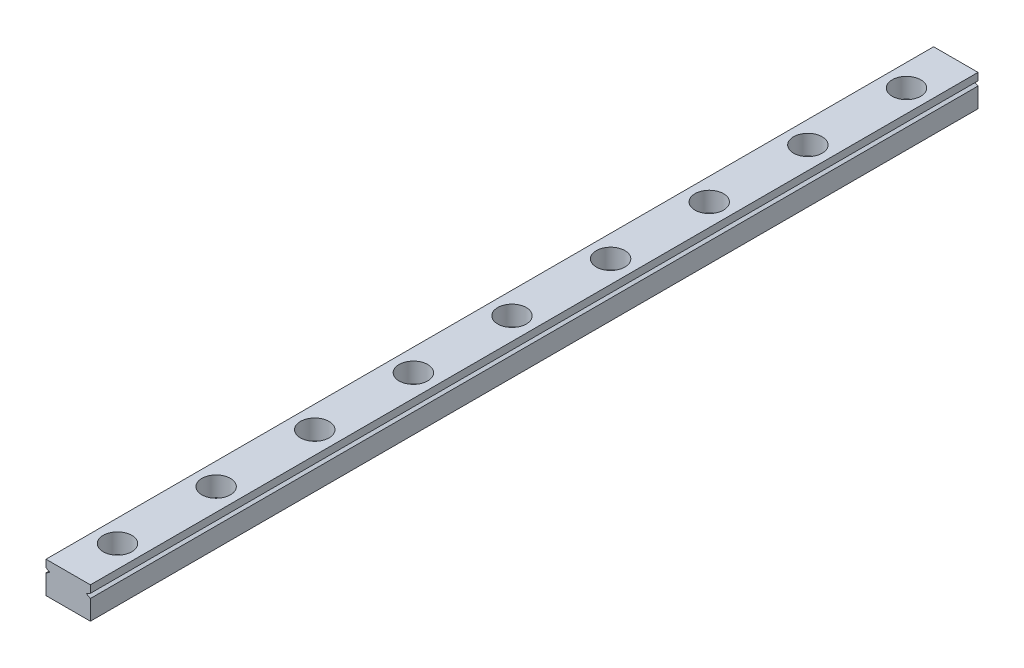
ISO-10303-21;
HEADER;
FILE_DESCRIPTION(('STEP AP214'),'2;1');
FILE_NAME('part.step','',(''),(''),'','','');
FILE_SCHEMA(('AUTOMOTIVE_DESIGN { 1 0 10303 214 1 1 1 1 }'));
ENDSEC;
DATA;
#1=APPLICATION_CONTEXT('core data for automotive mechanical design processes');
#2=APPLICATION_PROTOCOL_DEFINITION('international standard','automotive_design',2000,#1);
#3=PRODUCT_CONTEXT('',#1,'mechanical');
#4=PRODUCT('Part','Part','',(#3));
#5=PRODUCT_RELATED_PRODUCT_CATEGORY('part','',(#4));
#6=PRODUCT_DEFINITION_FORMATION('','',#4);
#7=PRODUCT_DEFINITION_CONTEXT('part definition',#1,'design');
#8=PRODUCT_DEFINITION('design','',#6,#7);
#9=PRODUCT_DEFINITION_SHAPE('','',#8);
#10=(LENGTH_UNIT() NAMED_UNIT(*) SI_UNIT(.MILLI.,.METRE.));
#11=(NAMED_UNIT(*) PLANE_ANGLE_UNIT() SI_UNIT($,.RADIAN.));
#12=(NAMED_UNIT(*) SI_UNIT($,.STERADIAN.) SOLID_ANGLE_UNIT());
#13=UNCERTAINTY_MEASURE_WITH_UNIT(LENGTH_MEASURE(1.E-05),#10,'distance_accuracy_value','');
#14=(GEOMETRIC_REPRESENTATION_CONTEXT(3) GLOBAL_UNCERTAINTY_ASSIGNED_CONTEXT((#13)) GLOBAL_UNIT_ASSIGNED_CONTEXT((#10,
#11,#12)) REPRESENTATION_CONTEXT('',''));
#15=CARTESIAN_POINT('',(0.,0.,0.));
#16=DIRECTION('',(0.,0.,1.));
#17=DIRECTION('',(1.,0.,0.));
#18=AXIS2_PLACEMENT_3D('',#15,#16,#17);
#19=CARTESIAN_POINT('',(0.,4.,180.));
#20=DIRECTION('',(1.,0.,0.));
#21=DIRECTION('',(0.,0.,-1.));
#22=AXIS2_PLACEMENT_3D('',#19,#20,#21);
#23=PLANE('',#22);
#24=DIRECTION('',(0.,-1.,0.));
#25=VECTOR('',#24,1.);
#26=CARTESIAN_POINT('',(0.,4.,0.));
#27=LINE('',#26,#25);
#28=CARTESIAN_POINT('',(0.,4.,0.));
#29=VERTEX_POINT('',#28);
#30=CARTESIAN_POINT('',(0.,0.,0.));
#31=VERTEX_POINT('',#30);
#32=EDGE_CURVE('E141',#29,#31,#27,.T.);
#33=ORIENTED_EDGE('',*,*,#32,.T.);
#34=DIRECTION('',(0.,0.,-1.));
#35=VECTOR('',#34,1.);
#36=CARTESIAN_POINT('',(0.,0.,180.));
#37=LINE('',#36,#35);
#38=CARTESIAN_POINT('',(0.,0.,180.));
#39=VERTEX_POINT('',#38);
#40=EDGE_CURVE('E11',#39,#31,#37,.T.);
#41=ORIENTED_EDGE('',*,*,#40,.F.);
#42=DIRECTION('',(0.,-1.,0.));
#43=VECTOR('',#42,1.);
#44=CARTESIAN_POINT('',(0.,4.,180.));
#45=LINE('',#44,#43);
#46=CARTESIAN_POINT('',(0.,4.,180.));
#47=VERTEX_POINT('',#46);
#48=EDGE_CURVE('E160',#47,#39,#45,.T.);
#49=ORIENTED_EDGE('',*,*,#48,.F.);
#50=DIRECTION('',(0.,0.,-1.));
#51=VECTOR('',#50,1.);
#52=CARTESIAN_POINT('',(0.,4.,180.));
#53=LINE('',#52,#51);
#54=EDGE_CURVE('E137',#47,#29,#53,.T.);
#55=ORIENTED_EDGE('',*,*,#54,.T.);
#56=EDGE_LOOP('',(#33,#41,#49,#55));
#57=FACE_BOUND('',#56,.T.);
#58=ADVANCED_FACE('F33',(#57),#23,.F.);
#59=CARTESIAN_POINT('',(0.,0.,180.));
#60=DIRECTION('',(0.,1.,0.));
#61=DIRECTION('',(0.,0.,1.));
#62=AXIS2_PLACEMENT_3D('',#59,#60,#61);
#63=PLANE('',#62);
#64=CARTESIAN_POINT('',(4.5,0.,170.));
#65=DIRECTION('',(0.,1.,0.));
#66=DIRECTION('',(0.,0.,1.));
#67=AXIS2_PLACEMENT_3D('',#64,#65,#66);
#68=CIRCLE('',#67,1.70000000000001);
#69=CARTESIAN_POINT('',(4.5,0.,171.7));
#70=VERTEX_POINT('',#69);
#71=EDGE_CURVE('E211',#70,#70,#68,.T.);
#72=ORIENTED_EDGE('',*,*,#71,.T.);
#73=EDGE_LOOP('',(#72));
#74=FACE_BOUND('',#73,.T.);
#75=CARTESIAN_POINT('',(4.49999999999993,0.,150.));
#76=DIRECTION('',(0.,1.,0.));
#77=DIRECTION('',(0.,0.,1.));
#78=AXIS2_PLACEMENT_3D('',#75,#76,#77);
#79=CIRCLE('',#78,1.70000000000001);
#80=CARTESIAN_POINT('',(4.49999999999993,0.,151.7));
#81=VERTEX_POINT('',#80);
#82=EDGE_CURVE('E306',#81,#81,#79,.T.);
#83=ORIENTED_EDGE('',*,*,#82,.T.);
#84=EDGE_LOOP('',(#83));
#85=FACE_BOUND('',#84,.T.);
#86=CARTESIAN_POINT('',(4.49999999999986,0.,130.));
#87=DIRECTION('',(0.,1.,0.));
#88=DIRECTION('',(0.,0.,1.));
#89=AXIS2_PLACEMENT_3D('',#86,#87,#88);
#90=CIRCLE('',#89,1.70000000000001);
#91=CARTESIAN_POINT('',(4.49999999999986,0.,131.7));
#92=VERTEX_POINT('',#91);
#93=EDGE_CURVE('E300',#92,#92,#90,.T.);
#94=ORIENTED_EDGE('',*,*,#93,.T.);
#95=EDGE_LOOP('',(#94));
#96=FACE_BOUND('',#95,.T.);
#97=CARTESIAN_POINT('',(4.49999999999979,0.,110.));
#98=DIRECTION('',(0.,1.,0.));
#99=DIRECTION('',(0.,0.,1.));
#100=AXIS2_PLACEMENT_3D('',#97,#98,#99);
#101=CIRCLE('',#100,1.70000000000001);
#102=CARTESIAN_POINT('',(4.49999999999979,0.,111.7));
#103=VERTEX_POINT('',#102);
#104=EDGE_CURVE('E294',#103,#103,#101,.T.);
#105=ORIENTED_EDGE('',*,*,#104,.T.);
#106=EDGE_LOOP('',(#105));
#107=FACE_BOUND('',#106,.T.);
#108=CARTESIAN_POINT('',(4.49999999999972,0.,90.));
#109=DIRECTION('',(0.,1.,0.));
#110=DIRECTION('',(0.,0.,1.));
#111=AXIS2_PLACEMENT_3D('',#108,#109,#110);
#112=CIRCLE('',#111,1.70000000000001);
#113=CARTESIAN_POINT('',(4.49999999999972,0.,91.7));
#114=VERTEX_POINT('',#113);
#115=EDGE_CURVE('E288',#114,#114,#112,.T.);
#116=ORIENTED_EDGE('',*,*,#115,.T.);
#117=EDGE_LOOP('',(#116));
#118=FACE_BOUND('',#117,.T.);
#119=CARTESIAN_POINT('',(4.49999999999965,0.,70.));
#120=DIRECTION('',(0.,1.,0.));
#121=DIRECTION('',(0.,0.,1.));
#122=AXIS2_PLACEMENT_3D('',#119,#120,#121);
#123=CIRCLE('',#122,1.70000000000001);
#124=CARTESIAN_POINT('',(4.49999999999965,0.,71.7));
#125=VERTEX_POINT('',#124);
#126=EDGE_CURVE('E282',#125,#125,#123,.T.);
#127=ORIENTED_EDGE('',*,*,#126,.T.);
#128=EDGE_LOOP('',(#127));
#129=FACE_BOUND('',#128,.T.);
#130=CARTESIAN_POINT('',(4.49999999999958,0.,50.));
#131=DIRECTION('',(0.,1.,0.));
#132=DIRECTION('',(0.,0.,1.));
#133=AXIS2_PLACEMENT_3D('',#130,#131,#132);
#134=CIRCLE('',#133,1.7);
#135=CARTESIAN_POINT('',(4.49999999999958,0.,51.7));
#136=VERTEX_POINT('',#135);
#137=EDGE_CURVE('E276',#136,#136,#134,.T.);
#138=ORIENTED_EDGE('',*,*,#137,.T.);
#139=EDGE_LOOP('',(#138));
#140=FACE_BOUND('',#139,.T.);
#141=CARTESIAN_POINT('',(4.49999999999951,0.,30.0000000000001));
#142=DIRECTION('',(0.,1.,0.));
#143=DIRECTION('',(0.,0.,1.));
#144=AXIS2_PLACEMENT_3D('',#141,#142,#143);
#145=CIRCLE('',#144,1.70000000000001);
#146=CARTESIAN_POINT('',(4.49999999999951,0.,31.7000000000001));
#147=VERTEX_POINT('',#146);
#148=EDGE_CURVE('E270',#147,#147,#145,.T.);
#149=ORIENTED_EDGE('',*,*,#148,.T.);
#150=EDGE_LOOP('',(#149));
#151=FACE_BOUND('',#150,.T.);
#152=CARTESIAN_POINT('',(4.49999999999944,0.,10.0000000000001));
#153=DIRECTION('',(0.,1.,0.));
#154=DIRECTION('',(0.,0.,1.));
#155=AXIS2_PLACEMENT_3D('',#152,#153,#154);
#156=CIRCLE('',#155,1.70000000000001);
#157=CARTESIAN_POINT('',(4.49999999999944,0.,11.7000000000001));
#158=VERTEX_POINT('',#157);
#159=EDGE_CURVE('E264',#158,#158,#156,.T.);
#160=ORIENTED_EDGE('',*,*,#159,.T.);
#161=EDGE_LOOP('',(#160));
#162=FACE_BOUND('',#161,.T.);
#163=DIRECTION('',(1.,0.,0.));
#164=VECTOR('',#163,1.);
#165=CARTESIAN_POINT('',(0.,0.,0.));
#166=LINE('',#165,#164);
#167=CARTESIAN_POINT('',(9.,0.,0.));
#168=VERTEX_POINT('',#167);
#169=EDGE_CURVE('E144',#31,#168,#166,.T.);
#170=ORIENTED_EDGE('',*,*,#169,.T.);
#171=DIRECTION('',(0.,0.,-1.));
#172=VECTOR('',#171,1.);
#173=CARTESIAN_POINT('',(9.,0.,180.));
#174=LINE('',#173,#172);
#175=CARTESIAN_POINT('',(9.,0.,180.));
#176=VERTEX_POINT('',#175);
#177=EDGE_CURVE('E41',#176,#168,#174,.T.);
#178=ORIENTED_EDGE('',*,*,#177,.F.);
#179=DIRECTION('',(1.,0.,0.));
#180=VECTOR('',#179,1.);
#181=CARTESIAN_POINT('',(0.,0.,180.));
#182=LINE('',#181,#180);
#183=EDGE_CURVE('E98',#39,#176,#182,.T.);
#184=ORIENTED_EDGE('',*,*,#183,.F.);
#185=ORIENTED_EDGE('',*,*,#40,.T.);
#186=EDGE_LOOP('',(#170,#178,#184,#185));
#187=FACE_BOUND('',#186,.T.);
#188=ADVANCED_FACE('F315',(#74,#85,#96,#107,#118,#129,#140,#151,#162,#187),#63,.F.);
#189=CARTESIAN_POINT('',(9.,4.,180.));
#190=DIRECTION('',(-1.,0.,0.));
#191=DIRECTION('',(0.,-1.,0.));
#192=AXIS2_PLACEMENT_3D('',#189,#190,#191);
#193=PLANE('',#192);
#194=DIRECTION('',(0.,1.,0.));
#195=VECTOR('',#194,1.);
#196=CARTESIAN_POINT('',(9.,4.,0.));
#197=LINE('',#196,#195);
#198=CARTESIAN_POINT('',(9.,4.,0.));
#199=VERTEX_POINT('',#198);
#200=EDGE_CURVE('E147',#168,#199,#197,.T.);
#201=ORIENTED_EDGE('',*,*,#200,.T.);
#202=DIRECTION('',(0.,0.,-1.));
#203=VECTOR('',#202,1.);
#204=CARTESIAN_POINT('',(9.,4.,180.));
#205=LINE('',#204,#203);
#206=CARTESIAN_POINT('',(9.,4.,180.));
#207=VERTEX_POINT('',#206);
#208=EDGE_CURVE('E173',#207,#199,#205,.T.);
#209=ORIENTED_EDGE('',*,*,#208,.F.);
#210=DIRECTION('',(0.,1.,0.));
#211=VECTOR('',#210,1.);
#212=CARTESIAN_POINT('',(9.,4.,180.));
#213=LINE('',#212,#211);
#214=EDGE_CURVE('E181',#176,#207,#213,.T.);
#215=ORIENTED_EDGE('',*,*,#214,.F.);
#216=ORIENTED_EDGE('',*,*,#177,.T.);
#217=EDGE_LOOP('',(#201,#209,#215,#216));
#218=FACE_BOUND('',#217,.T.);
#219=ADVANCED_FACE('F179',(#218),#193,.F.);
#220=CARTESIAN_POINT('',(8.2,4.45,180.));
#221=DIRECTION('',(-0.490261239632559,-0.871575537124549,0.));
#222=DIRECTION('',(0.87157553712455,-0.490261239632559,0.));
#223=AXIS2_PLACEMENT_3D('',#220,#221,#222);
#224=PLANE('',#223);
#225=DIRECTION('',(-0.871575537124549,0.490261239632559,0.));
#226=VECTOR('',#225,1.);
#227=CARTESIAN_POINT('',(8.2,4.45,0.));
#228=LINE('',#227,#226);
#229=CARTESIAN_POINT('',(8.2,4.45,0.));
#230=VERTEX_POINT('',#229);
#231=EDGE_CURVE('E149',#199,#230,#228,.T.);
#232=ORIENTED_EDGE('',*,*,#231,.T.);
#233=DIRECTION('',(0.,0.,-1.));
#234=VECTOR('',#233,1.);
#235=CARTESIAN_POINT('',(8.2,4.45,180.));
#236=LINE('',#235,#234);
#237=CARTESIAN_POINT('',(8.2,4.45,180.));
#238=VERTEX_POINT('',#237);
#239=EDGE_CURVE('E170',#238,#230,#236,.T.);
#240=ORIENTED_EDGE('',*,*,#239,.F.);
#241=DIRECTION('',(-0.871575537124549,0.490261239632559,0.));
#242=VECTOR('',#241,1.);
#243=CARTESIAN_POINT('',(8.2,4.45,180.));
#244=LINE('',#243,#242);
#245=EDGE_CURVE('E199',#207,#238,#244,.T.);
#246=ORIENTED_EDGE('',*,*,#245,.F.);
#247=ORIENTED_EDGE('',*,*,#208,.T.);
#248=EDGE_LOOP('',(#232,#240,#246,#247));
#249=FACE_BOUND('',#248,.T.);
#250=ADVANCED_FACE('F190',(#249),#224,.F.);
#251=CARTESIAN_POINT('',(9.,4.9,180.));
#252=DIRECTION('',(-0.490261239632559,0.871575537124549,0.));
#253=DIRECTION('',(-0.87157553712455,-0.490261239632559,0.));
#254=AXIS2_PLACEMENT_3D('',#251,#252,#253);
#255=PLANE('',#254);
#256=DIRECTION('',(0.871575537124549,0.490261239632559,0.));
#257=VECTOR('',#256,1.);
#258=CARTESIAN_POINT('',(9.,4.9,0.));
#259=LINE('',#258,#257);
#260=CARTESIAN_POINT('',(9.,4.9,0.));
#261=VERTEX_POINT('',#260);
#262=EDGE_CURVE('E151',#230,#261,#259,.T.);
#263=ORIENTED_EDGE('',*,*,#262,.T.);
#264=DIRECTION('',(0.,0.,-1.));
#265=VECTOR('',#264,1.);
#266=CARTESIAN_POINT('',(9.,4.9,180.));
#267=LINE('',#266,#265);
#268=CARTESIAN_POINT('',(9.,4.9,180.));
#269=VERTEX_POINT('',#268);
#270=EDGE_CURVE('E167',#269,#261,#267,.T.);
#271=ORIENTED_EDGE('',*,*,#270,.F.);
#272=DIRECTION('',(0.871575537124549,0.490261239632559,0.));
#273=VECTOR('',#272,1.);
#274=CARTESIAN_POINT('',(9.,4.9,180.));
#275=LINE('',#274,#273);
#276=EDGE_CURVE('E196',#238,#269,#275,.T.);
#277=ORIENTED_EDGE('',*,*,#276,.F.);
#278=ORIENTED_EDGE('',*,*,#239,.T.);
#279=EDGE_LOOP('',(#263,#271,#277,#278));
#280=FACE_BOUND('',#279,.T.);
#281=ADVANCED_FACE('F194',(#280),#255,.F.);
#282=CARTESIAN_POINT('',(9.,6.4,180.));
#283=DIRECTION('',(-1.,0.,0.));
#284=DIRECTION('',(0.,0.,1.));
#285=AXIS2_PLACEMENT_3D('',#282,#283,#284);
#286=PLANE('',#285);
#287=DIRECTION('',(0.,1.,0.));
#288=VECTOR('',#287,1.);
#289=CARTESIAN_POINT('',(9.,6.4,0.));
#290=LINE('',#289,#288);
#291=CARTESIAN_POINT('',(9.,6.4,0.));
#292=VERTEX_POINT('',#291);
#293=EDGE_CURVE('E153',#261,#292,#290,.T.);
#294=ORIENTED_EDGE('',*,*,#293,.T.);
#295=DIRECTION('',(0.,0.,-1.));
#296=VECTOR('',#295,1.);
#297=CARTESIAN_POINT('',(9.,6.4,180.));
#298=LINE('',#297,#296);
#299=CARTESIAN_POINT('',(9.,6.4,180.));
#300=VERTEX_POINT('',#299);
#301=EDGE_CURVE('E164',#300,#292,#298,.T.);
#302=ORIENTED_EDGE('',*,*,#301,.F.);
#303=DIRECTION('',(0.,1.,0.));
#304=VECTOR('',#303,1.);
#305=CARTESIAN_POINT('',(9.,6.4,180.));
#306=LINE('',#305,#304);
#307=EDGE_CURVE('E198',#269,#300,#306,.T.);
#308=ORIENTED_EDGE('',*,*,#307,.F.);
#309=ORIENTED_EDGE('',*,*,#270,.T.);
#310=EDGE_LOOP('',(#294,#302,#308,#309));
#311=FACE_BOUND('',#310,.T.);
#312=ADVANCED_FACE('F342',(#311),#286,.F.);
#313=CARTESIAN_POINT('',(0.,6.4,180.));
#314=DIRECTION('',(0.,-1.,0.));
#315=DIRECTION('',(0.,0.,-1.));
#316=AXIS2_PLACEMENT_3D('',#313,#314,#315);
#317=PLANE('',#316);
#318=CARTESIAN_POINT('',(4.5,6.4,170.));
#319=DIRECTION('',(0.,1.,0.));
#320=DIRECTION('',(0.,0.,1.));
#321=AXIS2_PLACEMENT_3D('',#318,#319,#320);
#322=CIRCLE('',#321,2.90000000000002);
#323=CARTESIAN_POINT('',(4.5,6.4,172.9));
#324=VERTEX_POINT('',#323);
#325=EDGE_CURVE('E256',#324,#324,#322,.T.);
#326=ORIENTED_EDGE('',*,*,#325,.F.);
#327=EDGE_LOOP('',(#326));
#328=FACE_BOUND('',#327,.T.);
#329=CARTESIAN_POINT('',(4.49999999999993,6.4,150.));
#330=DIRECTION('',(0.,1.,0.));
#331=DIRECTION('',(0.,0.,1.));
#332=AXIS2_PLACEMENT_3D('',#329,#330,#331);
#333=CIRCLE('',#332,2.90000000000002);
#334=CARTESIAN_POINT('',(4.49999999999993,6.4,152.9));
#335=VERTEX_POINT('',#334);
#336=EDGE_CURVE('E250',#335,#335,#333,.T.);
#337=ORIENTED_EDGE('',*,*,#336,.F.);
#338=EDGE_LOOP('',(#337));
#339=FACE_BOUND('',#338,.T.);
#340=CARTESIAN_POINT('',(4.49999999999986,6.4,130.));
#341=DIRECTION('',(0.,1.,0.));
#342=DIRECTION('',(0.,0.,1.));
#343=AXIS2_PLACEMENT_3D('',#340,#341,#342);
#344=CIRCLE('',#343,2.90000000000001);
#345=CARTESIAN_POINT('',(4.49999999999986,6.4,132.9));
#346=VERTEX_POINT('',#345);
#347=EDGE_CURVE('E244',#346,#346,#344,.T.);
#348=ORIENTED_EDGE('',*,*,#347,.F.);
#349=EDGE_LOOP('',(#348));
#350=FACE_BOUND('',#349,.T.);
#351=CARTESIAN_POINT('',(4.49999999999979,6.4,110.));
#352=DIRECTION('',(0.,1.,0.));
#353=DIRECTION('',(0.,0.,1.));
#354=AXIS2_PLACEMENT_3D('',#351,#352,#353);
#355=CIRCLE('',#354,2.9);
#356=CARTESIAN_POINT('',(4.49999999999979,6.4,112.9));
#357=VERTEX_POINT('',#356);
#358=EDGE_CURVE('E238',#357,#357,#355,.T.);
#359=ORIENTED_EDGE('',*,*,#358,.F.);
#360=EDGE_LOOP('',(#359));
#361=FACE_BOUND('',#360,.T.);
#362=CARTESIAN_POINT('',(4.49999999999972,6.4,90.));
#363=DIRECTION('',(0.,1.,0.));
#364=DIRECTION('',(0.,0.,1.));
#365=AXIS2_PLACEMENT_3D('',#362,#363,#364);
#366=CIRCLE('',#365,2.9);
#367=CARTESIAN_POINT('',(4.49999999999972,6.4,92.9));
#368=VERTEX_POINT('',#367);
#369=EDGE_CURVE('E232',#368,#368,#366,.T.);
#370=ORIENTED_EDGE('',*,*,#369,.F.);
#371=EDGE_LOOP('',(#370));
#372=FACE_BOUND('',#371,.T.);
#373=CARTESIAN_POINT('',(4.49999999999965,6.4,70.));
#374=DIRECTION('',(0.,1.,0.));
#375=DIRECTION('',(0.,0.,1.));
#376=AXIS2_PLACEMENT_3D('',#373,#374,#375);
#377=CIRCLE('',#376,2.9);
#378=CARTESIAN_POINT('',(4.49999999999965,6.4,72.9));
#379=VERTEX_POINT('',#378);
#380=EDGE_CURVE('E226',#379,#379,#377,.T.);
#381=ORIENTED_EDGE('',*,*,#380,.F.);
#382=EDGE_LOOP('',(#381));
#383=FACE_BOUND('',#382,.T.);
#384=CARTESIAN_POINT('',(4.49999999999958,6.4,50.));
#385=DIRECTION('',(0.,1.,0.));
#386=DIRECTION('',(0.,0.,1.));
#387=AXIS2_PLACEMENT_3D('',#384,#385,#386);
#388=CIRCLE('',#387,2.9);
#389=CARTESIAN_POINT('',(4.49999999999958,6.4,52.9));
#390=VERTEX_POINT('',#389);
#391=EDGE_CURVE('E220',#390,#390,#388,.T.);
#392=ORIENTED_EDGE('',*,*,#391,.F.);
#393=EDGE_LOOP('',(#392));
#394=FACE_BOUND('',#393,.T.);
#395=CARTESIAN_POINT('',(4.49999999999951,6.4,30.0000000000001));
#396=DIRECTION('',(0.,1.,0.));
#397=DIRECTION('',(0.,0.,1.));
#398=AXIS2_PLACEMENT_3D('',#395,#396,#397);
#399=CIRCLE('',#398,2.90000000000001);
#400=CARTESIAN_POINT('',(4.49999999999951,6.4,32.9000000000001));
#401=VERTEX_POINT('',#400);
#402=EDGE_CURVE('E214',#401,#401,#399,.T.);
#403=ORIENTED_EDGE('',*,*,#402,.F.);
#404=EDGE_LOOP('',(#403));
#405=FACE_BOUND('',#404,.T.);
#406=CARTESIAN_POINT('',(4.49999999999944,6.4,10.0000000000001));
#407=DIRECTION('',(0.,1.,0.));
#408=DIRECTION('',(0.,0.,1.));
#409=AXIS2_PLACEMENT_3D('',#406,#407,#408);
#410=CIRCLE('',#409,2.90000000000001);
#411=CARTESIAN_POINT('',(4.49999999999944,6.4,12.9000000000001));
#412=VERTEX_POINT('',#411);
#413=EDGE_CURVE('E207',#412,#412,#410,.T.);
#414=ORIENTED_EDGE('',*,*,#413,.F.);
#415=EDGE_LOOP('',(#414));
#416=FACE_BOUND('',#415,.T.);
#417=DIRECTION('',(-1.,0.,0.));
#418=VECTOR('',#417,1.);
#419=CARTESIAN_POINT('',(0.,6.4,0.));
#420=LINE('',#419,#418);
#421=CARTESIAN_POINT('',(0.,6.4,0.));
#422=VERTEX_POINT('',#421);
#423=EDGE_CURVE('E155',#292,#422,#420,.T.);
#424=ORIENTED_EDGE('',*,*,#423,.T.);
#425=DIRECTION('',(0.,0.,-1.));
#426=VECTOR('',#425,1.);
#427=CARTESIAN_POINT('',(0.,6.4,180.));
#428=LINE('',#427,#426);
#429=CARTESIAN_POINT('',(0.,6.4,180.));
#430=VERTEX_POINT('',#429);
#431=EDGE_CURVE('E132',#430,#422,#428,.T.);
#432=ORIENTED_EDGE('',*,*,#431,.F.);
#433=DIRECTION('',(-1.,0.,0.));
#434=VECTOR('',#433,1.);
#435=CARTESIAN_POINT('',(0.,6.4,180.));
#436=LINE('',#435,#434);
#437=EDGE_CURVE('E123',#300,#430,#436,.T.);
#438=ORIENTED_EDGE('',*,*,#437,.F.);
#439=ORIENTED_EDGE('',*,*,#301,.T.);
#440=EDGE_LOOP('',(#424,#432,#438,#439));
#441=FACE_BOUND('',#440,.T.);
#442=ADVANCED_FACE('F339',(#328,#339,#350,#361,#372,#383,#394,#405,#416,#441),#317,.F.);
#443=CARTESIAN_POINT('',(0.,6.4,180.));
#444=DIRECTION('',(1.,0.,0.));
#445=DIRECTION('',(0.,1.,0.));
#446=AXIS2_PLACEMENT_3D('',#443,#444,#445);
#447=PLANE('',#446);
#448=DIRECTION('',(0.,-1.,0.));
#449=VECTOR('',#448,1.);
#450=CARTESIAN_POINT('',(0.,6.4,0.));
#451=LINE('',#450,#449);
#452=CARTESIAN_POINT('',(0.,4.9,0.));
#453=VERTEX_POINT('',#452);
#454=EDGE_CURVE('E131',#422,#453,#451,.T.);
#455=ORIENTED_EDGE('',*,*,#454,.T.);
#456=DIRECTION('',(0.,0.,-1.));
#457=VECTOR('',#456,1.);
#458=CARTESIAN_POINT('',(0.,4.9,180.));
#459=LINE('',#458,#457);
#460=CARTESIAN_POINT('',(0.,4.9,180.));
#461=VERTEX_POINT('',#460);
#462=EDGE_CURVE('E128',#461,#453,#459,.T.);
#463=ORIENTED_EDGE('',*,*,#462,.F.);
#464=DIRECTION('',(0.,-1.,0.));
#465=VECTOR('',#464,1.);
#466=CARTESIAN_POINT('',(0.,6.4,180.));
#467=LINE('',#466,#465);
#468=EDGE_CURVE('E117',#430,#461,#467,.T.);
#469=ORIENTED_EDGE('',*,*,#468,.F.);
#470=ORIENTED_EDGE('',*,*,#431,.T.);
#471=EDGE_LOOP('',(#455,#463,#469,#470));
#472=FACE_BOUND('',#471,.T.);
#473=ADVANCED_FACE('F129',(#472),#447,.F.);
#474=CARTESIAN_POINT('',(0.,4.9,180.));
#475=DIRECTION('',(0.490261239632558,0.87157553712455,0.));
#476=DIRECTION('',(-0.87157553712455,0.490261239632558,0.));
#477=AXIS2_PLACEMENT_3D('',#474,#475,#476);
#478=PLANE('',#477);
#479=DIRECTION('',(0.87157553712455,-0.490261239632558,0.));
#480=VECTOR('',#479,1.);
#481=CARTESIAN_POINT('',(0.,4.9,0.));
#482=LINE('',#481,#480);
#483=CARTESIAN_POINT('',(0.800000000000001,4.45,0.));
#484=VERTEX_POINT('',#483);
#485=EDGE_CURVE('E84',#453,#484,#482,.T.);
#486=ORIENTED_EDGE('',*,*,#485,.T.);
#487=DIRECTION('',(0.,0.,-1.));
#488=VECTOR('',#487,1.);
#489=CARTESIAN_POINT('',(0.800000000000001,4.45,180.));
#490=LINE('',#489,#488);
#491=CARTESIAN_POINT('',(0.800000000000001,4.45,180.));
#492=VERTEX_POINT('',#491);
#493=EDGE_CURVE('E133',#492,#484,#490,.T.);
#494=ORIENTED_EDGE('',*,*,#493,.F.);
#495=DIRECTION('',(0.87157553712455,-0.490261239632558,0.));
#496=VECTOR('',#495,1.);
#497=CARTESIAN_POINT('',(0.,4.9,180.));
#498=LINE('',#497,#496);
#499=EDGE_CURVE('E121',#461,#492,#498,.T.);
#500=ORIENTED_EDGE('',*,*,#499,.F.);
#501=ORIENTED_EDGE('',*,*,#462,.T.);
#502=EDGE_LOOP('',(#486,#494,#500,#501));
#503=FACE_BOUND('',#502,.T.);
#504=ADVANCED_FACE('F135',(#503),#478,.F.);
#505=CARTESIAN_POINT('',(0.800000000000001,4.45,180.));
#506=DIRECTION('',(0.490261239632558,-0.87157553712455,0.));
#507=DIRECTION('',(0.87157553712455,0.490261239632558,0.));
#508=AXIS2_PLACEMENT_3D('',#505,#506,#507);
#509=PLANE('',#508);
#510=DIRECTION('',(-0.87157553712455,-0.490261239632558,0.));
#511=VECTOR('',#510,1.);
#512=CARTESIAN_POINT('',(0.800000000000001,4.45,0.));
#513=LINE('',#512,#511);
#514=EDGE_CURVE('E90',#484,#29,#513,.T.);
#515=ORIENTED_EDGE('',*,*,#514,.T.);
#516=ORIENTED_EDGE('',*,*,#54,.F.);
#517=DIRECTION('',(-0.87157553712455,-0.490261239632558,0.));
#518=VECTOR('',#517,1.);
#519=CARTESIAN_POINT('',(0.800000000000001,4.45,180.));
#520=LINE('',#519,#518);
#521=EDGE_CURVE('E49',#492,#47,#520,.T.);
#522=ORIENTED_EDGE('',*,*,#521,.F.);
#523=ORIENTED_EDGE('',*,*,#493,.T.);
#524=EDGE_LOOP('',(#515,#516,#522,#523));
#525=FACE_BOUND('',#524,.T.);
#526=ADVANCED_FACE('F365',(#525),#509,.F.);
#527=CARTESIAN_POINT('',(0.,0.,180.));
#528=DIRECTION('',(0.,0.,1.));
#529=DIRECTION('',(1.,0.,0.));
#530=AXIS2_PLACEMENT_3D('',#527,#528,#529);
#531=PLANE('',#530);
#532=ORIENTED_EDGE('',*,*,#48,.T.);
#533=ORIENTED_EDGE('',*,*,#183,.T.);
#534=ORIENTED_EDGE('',*,*,#214,.T.);
#535=ORIENTED_EDGE('',*,*,#245,.T.);
#536=ORIENTED_EDGE('',*,*,#276,.T.);
#537=ORIENTED_EDGE('',*,*,#307,.T.);
#538=ORIENTED_EDGE('',*,*,#437,.T.);
#539=ORIENTED_EDGE('',*,*,#468,.T.);
#540=ORIENTED_EDGE('',*,*,#499,.T.);
#541=ORIENTED_EDGE('',*,*,#521,.T.);
#542=EDGE_LOOP('',(#532,#533,#534,#535,#536,#537,#538,#539,#540,#541));
#543=FACE_BOUND('',#542,.T.);
#544=ADVANCED_FACE('F119',(#543),#531,.T.);
#545=CARTESIAN_POINT('',(0.,0.,0.));
#546=DIRECTION('',(0.,0.,1.));
#547=DIRECTION('',(1.,0.,0.));
#548=AXIS2_PLACEMENT_3D('',#545,#546,#547);
#549=PLANE('',#548);
#550=ORIENTED_EDGE('',*,*,#32,.F.);
#551=ORIENTED_EDGE('',*,*,#514,.F.);
#552=ORIENTED_EDGE('',*,*,#485,.F.);
#553=ORIENTED_EDGE('',*,*,#454,.F.);
#554=ORIENTED_EDGE('',*,*,#423,.F.);
#555=ORIENTED_EDGE('',*,*,#293,.F.);
#556=ORIENTED_EDGE('',*,*,#262,.F.);
#557=ORIENTED_EDGE('',*,*,#231,.F.);
#558=ORIENTED_EDGE('',*,*,#200,.F.);
#559=ORIENTED_EDGE('',*,*,#169,.F.);
#560=EDGE_LOOP('',(#550,#551,#552,#553,#554,#555,#556,#557,#558,#559));
#561=FACE_BOUND('',#560,.T.);
#562=ADVANCED_FACE('F185',(#561),#549,.F.);
#563=CARTESIAN_POINT('',(4.49999999999944,2.4,10.0000000000001));
#564=DIRECTION('',(0.,1.,0.));
#565=DIRECTION('',(0.,0.,1.));
#566=AXIS2_PLACEMENT_3D('',#563,#564,#565);
#567=CYLINDRICAL_SURFACE('',#566,2.90000000000001);
#568=CARTESIAN_POINT('',(4.49999999999944,2.4,10.0000000000001));
#569=DIRECTION('',(0.,1.,0.));
#570=DIRECTION('',(0.,0.,1.));
#571=AXIS2_PLACEMENT_3D('',#568,#569,#570);
#572=CIRCLE('',#571,2.90000000000001);
#573=CARTESIAN_POINT('',(4.49999999999944,2.4,12.9000000000001));
#574=VERTEX_POINT('',#573);
#575=EDGE_CURVE('E210',#574,#574,#572,.T.);
#576=ORIENTED_EDGE('',*,*,#575,.F.);
#577=EDGE_LOOP('',(#576));
#578=FACE_BOUND('',#577,.T.);
#579=ORIENTED_EDGE('',*,*,#413,.T.);
#580=EDGE_LOOP('',(#579));
#581=FACE_BOUND('',#580,.T.);
#582=ADVANCED_FACE('F419',(#578,#581),#567,.F.);
#583=CARTESIAN_POINT('',(4.49999999999944,2.4,10.0000000000001));
#584=DIRECTION('',(0.,1.,0.));
#585=DIRECTION('',(0.,0.,1.));
#586=AXIS2_PLACEMENT_3D('',#583,#584,#585);
#587=PLANE('',#586);
#588=CARTESIAN_POINT('',(4.49999999999944,2.4,10.0000000000001));
#589=DIRECTION('',(0.,1.,0.));
#590=DIRECTION('',(0.,0.,1.));
#591=AXIS2_PLACEMENT_3D('',#588,#589,#590);
#592=CIRCLE('',#591,1.70000000000001);
#593=CARTESIAN_POINT('',(4.49999999999944,2.4,11.7000000000001));
#594=VERTEX_POINT('',#593);
#595=EDGE_CURVE('E261',#594,#594,#592,.T.);
#596=ORIENTED_EDGE('',*,*,#595,.F.);
#597=EDGE_LOOP('',(#596));
#598=FACE_BOUND('',#597,.T.);
#599=ORIENTED_EDGE('',*,*,#575,.T.);
#600=EDGE_LOOP('',(#599));
#601=FACE_BOUND('',#600,.T.);
#602=ADVANCED_FACE('F433',(#598,#601),#587,.T.);
#603=CARTESIAN_POINT('',(4.49999999999951,2.4,30.0000000000001));
#604=DIRECTION('',(0.,1.,0.));
#605=DIRECTION('',(0.,0.,1.));
#606=AXIS2_PLACEMENT_3D('',#603,#604,#605);
#607=CYLINDRICAL_SURFACE('',#606,2.90000000000001);
#608=CARTESIAN_POINT('',(4.49999999999951,2.4,30.0000000000001));
#609=DIRECTION('',(0.,1.,0.));
#610=DIRECTION('',(0.,0.,1.));
#611=AXIS2_PLACEMENT_3D('',#608,#609,#610);
#612=CIRCLE('',#611,2.90000000000001);
#613=CARTESIAN_POINT('',(4.49999999999951,2.4,32.9000000000001));
#614=VERTEX_POINT('',#613);
#615=EDGE_CURVE('E217',#614,#614,#612,.T.);
#616=ORIENTED_EDGE('',*,*,#615,.F.);
#617=EDGE_LOOP('',(#616));
#618=FACE_BOUND('',#617,.T.);
#619=ORIENTED_EDGE('',*,*,#402,.T.);
#620=EDGE_LOOP('',(#619));
#621=FACE_BOUND('',#620,.T.);
#622=ADVANCED_FACE('F441',(#618,#621),#607,.F.);
#623=CARTESIAN_POINT('',(4.49999999999951,2.4,30.0000000000001));
#624=DIRECTION('',(0.,1.,0.));
#625=DIRECTION('',(0.,0.,1.));
#626=AXIS2_PLACEMENT_3D('',#623,#624,#625);
#627=PLANE('',#626);
#628=CARTESIAN_POINT('',(4.49999999999951,2.4,30.0000000000001));
#629=DIRECTION('',(0.,1.,0.));
#630=DIRECTION('',(0.,0.,1.));
#631=AXIS2_PLACEMENT_3D('',#628,#629,#630);
#632=CIRCLE('',#631,1.70000000000001);
#633=CARTESIAN_POINT('',(4.49999999999951,2.4,31.7000000000001));
#634=VERTEX_POINT('',#633);
#635=EDGE_CURVE('E267',#634,#634,#632,.T.);
#636=ORIENTED_EDGE('',*,*,#635,.F.);
#637=EDGE_LOOP('',(#636));
#638=FACE_BOUND('',#637,.T.);
#639=ORIENTED_EDGE('',*,*,#615,.T.);
#640=EDGE_LOOP('',(#639));
#641=FACE_BOUND('',#640,.T.);
#642=ADVANCED_FACE('F446',(#638,#641),#627,.T.);
#643=CARTESIAN_POINT('',(4.49999999999958,2.4,50.));
#644=DIRECTION('',(0.,1.,0.));
#645=DIRECTION('',(0.,0.,1.));
#646=AXIS2_PLACEMENT_3D('',#643,#644,#645);
#647=CYLINDRICAL_SURFACE('',#646,2.9);
#648=CARTESIAN_POINT('',(4.49999999999958,2.4,50.));
#649=DIRECTION('',(0.,1.,0.));
#650=DIRECTION('',(0.,0.,1.));
#651=AXIS2_PLACEMENT_3D('',#648,#649,#650);
#652=CIRCLE('',#651,2.9);
#653=CARTESIAN_POINT('',(4.49999999999958,2.4,52.9));
#654=VERTEX_POINT('',#653);
#655=EDGE_CURVE('E223',#654,#654,#652,.T.);
#656=ORIENTED_EDGE('',*,*,#655,.F.);
#657=EDGE_LOOP('',(#656));
#658=FACE_BOUND('',#657,.T.);
#659=ORIENTED_EDGE('',*,*,#391,.T.);
#660=EDGE_LOOP('',(#659));
#661=FACE_BOUND('',#660,.T.);
#662=ADVANCED_FACE('F454',(#658,#661),#647,.F.);
#663=CARTESIAN_POINT('',(4.49999999999958,2.4,50.));
#664=DIRECTION('',(0.,1.,0.));
#665=DIRECTION('',(0.,0.,1.));
#666=AXIS2_PLACEMENT_3D('',#663,#664,#665);
#667=PLANE('',#666);
#668=CARTESIAN_POINT('',(4.49999999999958,2.4,50.));
#669=DIRECTION('',(0.,1.,0.));
#670=DIRECTION('',(0.,0.,1.));
#671=AXIS2_PLACEMENT_3D('',#668,#669,#670);
#672=CIRCLE('',#671,1.7);
#673=CARTESIAN_POINT('',(4.49999999999958,2.4,51.7));
#674=VERTEX_POINT('',#673);
#675=EDGE_CURVE('E273',#674,#674,#672,.T.);
#676=ORIENTED_EDGE('',*,*,#675,.F.);
#677=EDGE_LOOP('',(#676));
#678=FACE_BOUND('',#677,.T.);
#679=ORIENTED_EDGE('',*,*,#655,.T.);
#680=EDGE_LOOP('',(#679));
#681=FACE_BOUND('',#680,.T.);
#682=ADVANCED_FACE('F459',(#678,#681),#667,.T.);
#683=CARTESIAN_POINT('',(4.49999999999965,2.4,70.));
#684=DIRECTION('',(0.,1.,0.));
#685=DIRECTION('',(0.,0.,1.));
#686=AXIS2_PLACEMENT_3D('',#683,#684,#685);
#687=CYLINDRICAL_SURFACE('',#686,2.9);
#688=CARTESIAN_POINT('',(4.49999999999965,2.4,70.));
#689=DIRECTION('',(0.,1.,0.));
#690=DIRECTION('',(0.,0.,1.));
#691=AXIS2_PLACEMENT_3D('',#688,#689,#690);
#692=CIRCLE('',#691,2.9);
#693=CARTESIAN_POINT('',(4.49999999999965,2.4,72.9));
#694=VERTEX_POINT('',#693);
#695=EDGE_CURVE('E229',#694,#694,#692,.T.);
#696=ORIENTED_EDGE('',*,*,#695,.F.);
#697=EDGE_LOOP('',(#696));
#698=FACE_BOUND('',#697,.T.);
#699=ORIENTED_EDGE('',*,*,#380,.T.);
#700=EDGE_LOOP('',(#699));
#701=FACE_BOUND('',#700,.T.);
#702=ADVANCED_FACE('F467',(#698,#701),#687,.F.);
#703=CARTESIAN_POINT('',(4.49999999999965,2.4,70.));
#704=DIRECTION('',(0.,1.,0.));
#705=DIRECTION('',(0.,0.,1.));
#706=AXIS2_PLACEMENT_3D('',#703,#704,#705);
#707=PLANE('',#706);
#708=CARTESIAN_POINT('',(4.49999999999965,2.4,70.));
#709=DIRECTION('',(0.,1.,0.));
#710=DIRECTION('',(0.,0.,1.));
#711=AXIS2_PLACEMENT_3D('',#708,#709,#710);
#712=CIRCLE('',#711,1.70000000000001);
#713=CARTESIAN_POINT('',(4.49999999999965,2.4,71.7));
#714=VERTEX_POINT('',#713);
#715=EDGE_CURVE('E279',#714,#714,#712,.T.);
#716=ORIENTED_EDGE('',*,*,#715,.F.);
#717=EDGE_LOOP('',(#716));
#718=FACE_BOUND('',#717,.T.);
#719=ORIENTED_EDGE('',*,*,#695,.T.);
#720=EDGE_LOOP('',(#719));
#721=FACE_BOUND('',#720,.T.);
#722=ADVANCED_FACE('F472',(#718,#721),#707,.T.);
#723=CARTESIAN_POINT('',(4.49999999999972,2.4,90.));
#724=DIRECTION('',(0.,1.,0.));
#725=DIRECTION('',(0.,0.,1.));
#726=AXIS2_PLACEMENT_3D('',#723,#724,#725);
#727=CYLINDRICAL_SURFACE('',#726,2.9);
#728=CARTESIAN_POINT('',(4.49999999999972,2.4,90.));
#729=DIRECTION('',(0.,1.,0.));
#730=DIRECTION('',(0.,0.,1.));
#731=AXIS2_PLACEMENT_3D('',#728,#729,#730);
#732=CIRCLE('',#731,2.9);
#733=CARTESIAN_POINT('',(4.49999999999972,2.4,92.9));
#734=VERTEX_POINT('',#733);
#735=EDGE_CURVE('E235',#734,#734,#732,.T.);
#736=ORIENTED_EDGE('',*,*,#735,.F.);
#737=EDGE_LOOP('',(#736));
#738=FACE_BOUND('',#737,.T.);
#739=ORIENTED_EDGE('',*,*,#369,.T.);
#740=EDGE_LOOP('',(#739));
#741=FACE_BOUND('',#740,.T.);
#742=ADVANCED_FACE('F480',(#738,#741),#727,.F.);
#743=CARTESIAN_POINT('',(4.49999999999972,2.4,90.));
#744=DIRECTION('',(0.,1.,0.));
#745=DIRECTION('',(0.,0.,1.));
#746=AXIS2_PLACEMENT_3D('',#743,#744,#745);
#747=PLANE('',#746);
#748=CARTESIAN_POINT('',(4.49999999999972,2.4,90.));
#749=DIRECTION('',(0.,1.,0.));
#750=DIRECTION('',(0.,0.,1.));
#751=AXIS2_PLACEMENT_3D('',#748,#749,#750);
#752=CIRCLE('',#751,1.70000000000001);
#753=CARTESIAN_POINT('',(4.49999999999972,2.4,91.7));
#754=VERTEX_POINT('',#753);
#755=EDGE_CURVE('E285',#754,#754,#752,.T.);
#756=ORIENTED_EDGE('',*,*,#755,.F.);
#757=EDGE_LOOP('',(#756));
#758=FACE_BOUND('',#757,.T.);
#759=ORIENTED_EDGE('',*,*,#735,.T.);
#760=EDGE_LOOP('',(#759));
#761=FACE_BOUND('',#760,.T.);
#762=ADVANCED_FACE('F485',(#758,#761),#747,.T.);
#763=CARTESIAN_POINT('',(4.49999999999979,2.4,110.));
#764=DIRECTION('',(0.,1.,0.));
#765=DIRECTION('',(0.,0.,1.));
#766=AXIS2_PLACEMENT_3D('',#763,#764,#765);
#767=CYLINDRICAL_SURFACE('',#766,2.9);
#768=CARTESIAN_POINT('',(4.49999999999979,2.4,110.));
#769=DIRECTION('',(0.,1.,0.));
#770=DIRECTION('',(0.,0.,1.));
#771=AXIS2_PLACEMENT_3D('',#768,#769,#770);
#772=CIRCLE('',#771,2.9);
#773=CARTESIAN_POINT('',(4.49999999999979,2.4,112.9));
#774=VERTEX_POINT('',#773);
#775=EDGE_CURVE('E241',#774,#774,#772,.T.);
#776=ORIENTED_EDGE('',*,*,#775,.F.);
#777=EDGE_LOOP('',(#776));
#778=FACE_BOUND('',#777,.T.);
#779=ORIENTED_EDGE('',*,*,#358,.T.);
#780=EDGE_LOOP('',(#779));
#781=FACE_BOUND('',#780,.T.);
#782=ADVANCED_FACE('F493',(#778,#781),#767,.F.);
#783=CARTESIAN_POINT('',(4.49999999999979,2.4,110.));
#784=DIRECTION('',(0.,1.,0.));
#785=DIRECTION('',(0.,0.,1.));
#786=AXIS2_PLACEMENT_3D('',#783,#784,#785);
#787=PLANE('',#786);
#788=CARTESIAN_POINT('',(4.49999999999979,2.4,110.));
#789=DIRECTION('',(0.,1.,0.));
#790=DIRECTION('',(0.,0.,1.));
#791=AXIS2_PLACEMENT_3D('',#788,#789,#790);
#792=CIRCLE('',#791,1.70000000000001);
#793=CARTESIAN_POINT('',(4.49999999999979,2.4,111.7));
#794=VERTEX_POINT('',#793);
#795=EDGE_CURVE('E291',#794,#794,#792,.T.);
#796=ORIENTED_EDGE('',*,*,#795,.F.);
#797=EDGE_LOOP('',(#796));
#798=FACE_BOUND('',#797,.T.);
#799=ORIENTED_EDGE('',*,*,#775,.T.);
#800=EDGE_LOOP('',(#799));
#801=FACE_BOUND('',#800,.T.);
#802=ADVANCED_FACE('F498',(#798,#801),#787,.T.);
#803=CARTESIAN_POINT('',(4.49999999999986,2.4,130.));
#804=DIRECTION('',(0.,1.,0.));
#805=DIRECTION('',(0.,0.,1.));
#806=AXIS2_PLACEMENT_3D('',#803,#804,#805);
#807=CYLINDRICAL_SURFACE('',#806,2.90000000000001);
#808=CARTESIAN_POINT('',(4.49999999999986,2.4,130.));
#809=DIRECTION('',(0.,1.,0.));
#810=DIRECTION('',(0.,0.,1.));
#811=AXIS2_PLACEMENT_3D('',#808,#809,#810);
#812=CIRCLE('',#811,2.90000000000001);
#813=CARTESIAN_POINT('',(4.49999999999986,2.4,132.9));
#814=VERTEX_POINT('',#813);
#815=EDGE_CURVE('E247',#814,#814,#812,.T.);
#816=ORIENTED_EDGE('',*,*,#815,.F.);
#817=EDGE_LOOP('',(#816));
#818=FACE_BOUND('',#817,.T.);
#819=ORIENTED_EDGE('',*,*,#347,.T.);
#820=EDGE_LOOP('',(#819));
#821=FACE_BOUND('',#820,.T.);
#822=ADVANCED_FACE('F506',(#818,#821),#807,.F.);
#823=CARTESIAN_POINT('',(4.49999999999986,2.4,130.));
#824=DIRECTION('',(0.,1.,0.));
#825=DIRECTION('',(0.,0.,1.));
#826=AXIS2_PLACEMENT_3D('',#823,#824,#825);
#827=PLANE('',#826);
#828=CARTESIAN_POINT('',(4.49999999999986,2.4,130.));
#829=DIRECTION('',(0.,1.,0.));
#830=DIRECTION('',(0.,0.,1.));
#831=AXIS2_PLACEMENT_3D('',#828,#829,#830);
#832=CIRCLE('',#831,1.70000000000001);
#833=CARTESIAN_POINT('',(4.49999999999986,2.4,131.7));
#834=VERTEX_POINT('',#833);
#835=EDGE_CURVE('E297',#834,#834,#832,.T.);
#836=ORIENTED_EDGE('',*,*,#835,.F.);
#837=EDGE_LOOP('',(#836));
#838=FACE_BOUND('',#837,.T.);
#839=ORIENTED_EDGE('',*,*,#815,.T.);
#840=EDGE_LOOP('',(#839));
#841=FACE_BOUND('',#840,.T.);
#842=ADVANCED_FACE('F511',(#838,#841),#827,.T.);
#843=CARTESIAN_POINT('',(4.49999999999993,2.4,150.));
#844=DIRECTION('',(0.,1.,0.));
#845=DIRECTION('',(0.,0.,1.));
#846=AXIS2_PLACEMENT_3D('',#843,#844,#845);
#847=CYLINDRICAL_SURFACE('',#846,2.90000000000002);
#848=CARTESIAN_POINT('',(4.49999999999993,2.4,150.));
#849=DIRECTION('',(0.,1.,0.));
#850=DIRECTION('',(0.,0.,1.));
#851=AXIS2_PLACEMENT_3D('',#848,#849,#850);
#852=CIRCLE('',#851,2.90000000000002);
#853=CARTESIAN_POINT('',(4.49999999999993,2.4,152.9));
#854=VERTEX_POINT('',#853);
#855=EDGE_CURVE('E253',#854,#854,#852,.T.);
#856=ORIENTED_EDGE('',*,*,#855,.F.);
#857=EDGE_LOOP('',(#856));
#858=FACE_BOUND('',#857,.T.);
#859=ORIENTED_EDGE('',*,*,#336,.T.);
#860=EDGE_LOOP('',(#859));
#861=FACE_BOUND('',#860,.T.);
#862=ADVANCED_FACE('F519',(#858,#861),#847,.F.);
#863=CARTESIAN_POINT('',(4.49999999999993,2.4,150.));
#864=DIRECTION('',(0.,1.,0.));
#865=DIRECTION('',(0.,0.,1.));
#866=AXIS2_PLACEMENT_3D('',#863,#864,#865);
#867=PLANE('',#866);
#868=CARTESIAN_POINT('',(4.49999999999993,2.4,150.));
#869=DIRECTION('',(0.,1.,0.));
#870=DIRECTION('',(0.,0.,1.));
#871=AXIS2_PLACEMENT_3D('',#868,#869,#870);
#872=CIRCLE('',#871,1.70000000000001);
#873=CARTESIAN_POINT('',(4.49999999999993,2.4,151.7));
#874=VERTEX_POINT('',#873);
#875=EDGE_CURVE('E303',#874,#874,#872,.T.);
#876=ORIENTED_EDGE('',*,*,#875,.F.);
#877=EDGE_LOOP('',(#876));
#878=FACE_BOUND('',#877,.T.);
#879=ORIENTED_EDGE('',*,*,#855,.T.);
#880=EDGE_LOOP('',(#879));
#881=FACE_BOUND('',#880,.T.);
#882=ADVANCED_FACE('F335',(#878,#881),#867,.T.);
#883=CARTESIAN_POINT('',(4.5,2.4,170.));
#884=DIRECTION('',(0.,1.,0.));
#885=DIRECTION('',(0.,0.,1.));
#886=AXIS2_PLACEMENT_3D('',#883,#884,#885);
#887=CYLINDRICAL_SURFACE('',#886,2.90000000000002);
#888=CARTESIAN_POINT('',(4.5,2.4,170.));
#889=DIRECTION('',(0.,1.,0.));
#890=DIRECTION('',(0.,0.,1.));
#891=AXIS2_PLACEMENT_3D('',#888,#889,#890);
#892=CIRCLE('',#891,2.90000000000002);
#893=CARTESIAN_POINT('',(4.5,2.4,172.9));
#894=VERTEX_POINT('',#893);
#895=EDGE_CURVE('E145',#894,#894,#892,.T.);
#896=ORIENTED_EDGE('',*,*,#895,.F.);
#897=EDGE_LOOP('',(#896));
#898=FACE_BOUND('',#897,.T.);
#899=ORIENTED_EDGE('',*,*,#325,.T.);
#900=EDGE_LOOP('',(#899));
#901=FACE_BOUND('',#900,.T.);
#902=ADVANCED_FACE('F329',(#898,#901),#887,.F.);
#903=CARTESIAN_POINT('',(4.5,2.4,170.));
#904=DIRECTION('',(0.,1.,0.));
#905=DIRECTION('',(0.,0.,1.));
#906=AXIS2_PLACEMENT_3D('',#903,#904,#905);
#907=PLANE('',#906);
#908=CARTESIAN_POINT('',(4.5,2.4,170.));
#909=DIRECTION('',(0.,1.,0.));
#910=DIRECTION('',(0.,0.,1.));
#911=AXIS2_PLACEMENT_3D('',#908,#909,#910);
#912=CIRCLE('',#911,1.70000000000001);
#913=CARTESIAN_POINT('',(4.5,2.4,171.7));
#914=VERTEX_POINT('',#913);
#915=EDGE_CURVE('E309',#914,#914,#912,.T.);
#916=ORIENTED_EDGE('',*,*,#915,.F.);
#917=EDGE_LOOP('',(#916));
#918=FACE_BOUND('',#917,.T.);
#919=ORIENTED_EDGE('',*,*,#895,.T.);
#920=EDGE_LOOP('',(#919));
#921=FACE_BOUND('',#920,.T.);
#922=ADVANCED_FACE('F325',(#918,#921),#907,.T.);
#923=CARTESIAN_POINT('',(4.49999999999944,0.,10.0000000000001));
#924=DIRECTION('',(0.,1.,0.));
#925=DIRECTION('',(0.,0.,1.));
#926=AXIS2_PLACEMENT_3D('',#923,#924,#925);
#927=CYLINDRICAL_SURFACE('',#926,1.70000000000001);
#928=ORIENTED_EDGE('',*,*,#159,.F.);
#929=EDGE_LOOP('',(#928));
#930=FACE_BOUND('',#929,.T.);
#931=ORIENTED_EDGE('',*,*,#595,.T.);
#932=EDGE_LOOP('',(#931));
#933=FACE_BOUND('',#932,.T.);
#934=ADVANCED_FACE('F328',(#930,#933),#927,.F.);
#935=CARTESIAN_POINT('',(4.49999999999951,0.,30.0000000000001));
#936=DIRECTION('',(0.,1.,0.));
#937=DIRECTION('',(0.,0.,1.));
#938=AXIS2_PLACEMENT_3D('',#935,#936,#937);
#939=CYLINDRICAL_SURFACE('',#938,1.70000000000001);
#940=ORIENTED_EDGE('',*,*,#148,.F.);
#941=EDGE_LOOP('',(#940));
#942=FACE_BOUND('',#941,.T.);
#943=ORIENTED_EDGE('',*,*,#635,.T.);
#944=EDGE_LOOP('',(#943));
#945=FACE_BOUND('',#944,.T.);
#946=ADVANCED_FACE('F609',(#942,#945),#939,.F.);
#947=CARTESIAN_POINT('',(4.49999999999958,0.,50.));
#948=DIRECTION('',(0.,1.,0.));
#949=DIRECTION('',(0.,0.,1.));
#950=AXIS2_PLACEMENT_3D('',#947,#948,#949);
#951=CYLINDRICAL_SURFACE('',#950,1.7);
#952=ORIENTED_EDGE('',*,*,#137,.F.);
#953=EDGE_LOOP('',(#952));
#954=FACE_BOUND('',#953,.T.);
#955=ORIENTED_EDGE('',*,*,#675,.T.);
#956=EDGE_LOOP('',(#955));
#957=FACE_BOUND('',#956,.T.);
#958=ADVANCED_FACE('F619',(#954,#957),#951,.F.);
#959=CARTESIAN_POINT('',(4.49999999999965,0.,70.));
#960=DIRECTION('',(0.,1.,0.));
#961=DIRECTION('',(0.,0.,1.));
#962=AXIS2_PLACEMENT_3D('',#959,#960,#961);
#963=CYLINDRICAL_SURFACE('',#962,1.70000000000001);
#964=ORIENTED_EDGE('',*,*,#126,.F.);
#965=EDGE_LOOP('',(#964));
#966=FACE_BOUND('',#965,.T.);
#967=ORIENTED_EDGE('',*,*,#715,.T.);
#968=EDGE_LOOP('',(#967));
#969=FACE_BOUND('',#968,.T.);
#970=ADVANCED_FACE('F629',(#966,#969),#963,.F.);
#971=CARTESIAN_POINT('',(4.49999999999972,0.,90.));
#972=DIRECTION('',(0.,1.,0.));
#973=DIRECTION('',(0.,0.,1.));
#974=AXIS2_PLACEMENT_3D('',#971,#972,#973);
#975=CYLINDRICAL_SURFACE('',#974,1.70000000000001);
#976=ORIENTED_EDGE('',*,*,#115,.F.);
#977=EDGE_LOOP('',(#976));
#978=FACE_BOUND('',#977,.T.);
#979=ORIENTED_EDGE('',*,*,#755,.T.);
#980=EDGE_LOOP('',(#979));
#981=FACE_BOUND('',#980,.T.);
#982=ADVANCED_FACE('F639',(#978,#981),#975,.F.);
#983=CARTESIAN_POINT('',(4.49999999999979,0.,110.));
#984=DIRECTION('',(0.,1.,0.));
#985=DIRECTION('',(0.,0.,1.));
#986=AXIS2_PLACEMENT_3D('',#983,#984,#985);
#987=CYLINDRICAL_SURFACE('',#986,1.70000000000001);
#988=ORIENTED_EDGE('',*,*,#104,.F.);
#989=EDGE_LOOP('',(#988));
#990=FACE_BOUND('',#989,.T.);
#991=ORIENTED_EDGE('',*,*,#795,.T.);
#992=EDGE_LOOP('',(#991));
#993=FACE_BOUND('',#992,.T.);
#994=ADVANCED_FACE('F649',(#990,#993),#987,.F.);
#995=CARTESIAN_POINT('',(4.49999999999986,0.,130.));
#996=DIRECTION('',(0.,1.,0.));
#997=DIRECTION('',(0.,0.,1.));
#998=AXIS2_PLACEMENT_3D('',#995,#996,#997);
#999=CYLINDRICAL_SURFACE('',#998,1.70000000000001);
#1000=ORIENTED_EDGE('',*,*,#93,.F.);
#1001=EDGE_LOOP('',(#1000));
#1002=FACE_BOUND('',#1001,.T.);
#1003=ORIENTED_EDGE('',*,*,#835,.T.);
#1004=EDGE_LOOP('',(#1003));
#1005=FACE_BOUND('',#1004,.T.);
#1006=ADVANCED_FACE('F659',(#1002,#1005),#999,.F.);
#1007=CARTESIAN_POINT('',(4.49999999999993,0.,150.));
#1008=DIRECTION('',(0.,1.,0.));
#1009=DIRECTION('',(0.,0.,1.));
#1010=AXIS2_PLACEMENT_3D('',#1007,#1008,#1009);
#1011=CYLINDRICAL_SURFACE('',#1010,1.70000000000001);
#1012=ORIENTED_EDGE('',*,*,#82,.F.);
#1013=EDGE_LOOP('',(#1012));
#1014=FACE_BOUND('',#1013,.T.);
#1015=ORIENTED_EDGE('',*,*,#875,.T.);
#1016=EDGE_LOOP('',(#1015));
#1017=FACE_BOUND('',#1016,.T.);
#1018=ADVANCED_FACE('F321',(#1014,#1017),#1011,.F.);
#1019=CARTESIAN_POINT('',(4.5,0.,170.));
#1020=DIRECTION('',(0.,1.,0.));
#1021=DIRECTION('',(0.,0.,1.));
#1022=AXIS2_PLACEMENT_3D('',#1019,#1020,#1021);
#1023=CYLINDRICAL_SURFACE('',#1022,1.70000000000001);
#1024=ORIENTED_EDGE('',*,*,#71,.F.);
#1025=EDGE_LOOP('',(#1024));
#1026=FACE_BOUND('',#1025,.T.);
#1027=ORIENTED_EDGE('',*,*,#915,.T.);
#1028=EDGE_LOOP('',(#1027));
#1029=FACE_BOUND('',#1028,.T.);
#1030=ADVANCED_FACE('F318',(#1026,#1029),#1023,.F.);
#1031=CLOSED_SHELL('',(#58,#188,#219,#250,#281,#312,#442,#473,#504,#526,#544,#562,#582,#602,
#622,#642,#662,#682,#702,#722,#742,#762,#782,#802,#822,#842,#862,#882,#902,#922,#934,#946,#958,
#970,#982,#994,#1006,#1018,#1030));
#1032=MANIFOLD_SOLID_BREP('B2',#1031);
#1033=ADVANCED_BREP_SHAPE_REPRESENTATION('',(#18,#1032),#14);
#1034=SHAPE_DEFINITION_REPRESENTATION(#9,#1033);
ENDSEC;
END-ISO-10303-21;
